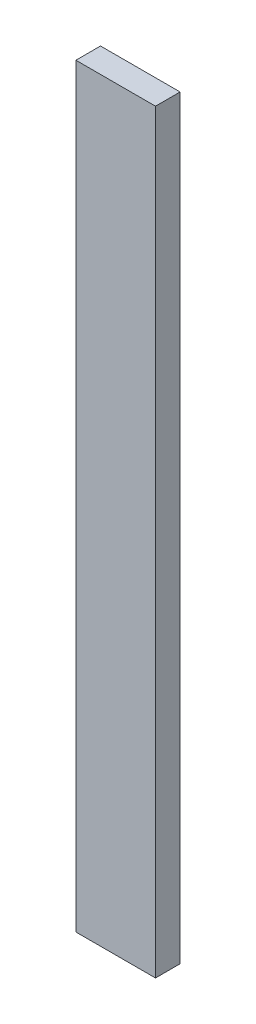
ISO-10303-21;
HEADER;
FILE_DESCRIPTION(('STEP AP214'),'2;1');
FILE_NAME('part.step','',(''),(''),'','','');
FILE_SCHEMA(('AUTOMOTIVE_DESIGN { 1 0 10303 214 1 1 1 1 }'));
ENDSEC;
DATA;
#1=APPLICATION_CONTEXT('core data for automotive mechanical design processes');
#2=APPLICATION_PROTOCOL_DEFINITION('international standard','automotive_design',2000,#1);
#3=PRODUCT_CONTEXT('',#1,'mechanical');
#4=PRODUCT('Part','Part','',(#3));
#5=PRODUCT_RELATED_PRODUCT_CATEGORY('part','',(#4));
#6=PRODUCT_DEFINITION_FORMATION('','',#4);
#7=PRODUCT_DEFINITION_CONTEXT('part definition',#1,'design');
#8=PRODUCT_DEFINITION('design','',#6,#7);
#9=PRODUCT_DEFINITION_SHAPE('','',#8);
#10=(LENGTH_UNIT() NAMED_UNIT(*) SI_UNIT(.MILLI.,.METRE.));
#11=(NAMED_UNIT(*) PLANE_ANGLE_UNIT() SI_UNIT($,.RADIAN.));
#12=(NAMED_UNIT(*) SI_UNIT($,.STERADIAN.) SOLID_ANGLE_UNIT());
#13=UNCERTAINTY_MEASURE_WITH_UNIT(LENGTH_MEASURE(1.E-05),#10,'distance_accuracy_value','');
#14=(GEOMETRIC_REPRESENTATION_CONTEXT(3) GLOBAL_UNCERTAINTY_ASSIGNED_CONTEXT((#13)) GLOBAL_UNIT_ASSIGNED_CONTEXT((#10,
#11,#12)) REPRESENTATION_CONTEXT('',''));
#15=CARTESIAN_POINT('',(0.,0.,0.));
#16=DIRECTION('',(0.,0.,1.));
#17=DIRECTION('',(1.,0.,0.));
#18=AXIS2_PLACEMENT_3D('',#15,#16,#17);
#19=CARTESIAN_POINT('',(-2.91645064696626,-1.83320044296789,6.5));
#20=DIRECTION('',(0.,0.,1.));
#21=DIRECTION('',(1.,0.,0.));
#22=AXIS2_PLACEMENT_3D('',#19,#20,#21);
#23=PLANE('',#22);
#24=DIRECTION('',(0.,1.,0.));
#25=VECTOR('',#24,1.);
#26=CARTESIAN_POINT('',(-1.94645064696626,7.36679955703211,6.5));
#27=LINE('',#26,#25);
#28=CARTESIAN_POINT('',(-1.94645064696626,7.36679955703211,6.5));
#29=VERTEX_POINT('',#28);
#30=CARTESIAN_POINT('',(-1.94645064696626,-1.83320044296789,6.5));
#31=VERTEX_POINT('',#30);
#32=EDGE_CURVE('E58',#29,#31,#27,.F.);
#33=ORIENTED_EDGE('',*,*,#32,.F.);
#34=DIRECTION('',(1.,0.,0.));
#35=VECTOR('',#34,1.);
#36=CARTESIAN_POINT('',(-2.91645064696626,7.36679955703211,6.5));
#37=LINE('',#36,#35);
#38=CARTESIAN_POINT('',(-2.91645064696626,7.36679955703211,6.5));
#39=VERTEX_POINT('',#38);
#40=EDGE_CURVE('E53',#39,#29,#37,.T.);
#41=ORIENTED_EDGE('',*,*,#40,.F.);
#42=DIRECTION('',(0.,-1.,0.));
#43=VECTOR('',#42,1.);
#44=CARTESIAN_POINT('',(-2.91645064696626,7.36679955703211,6.5));
#45=LINE('',#44,#43);
#46=CARTESIAN_POINT('',(-2.91645064696626,-1.83320044296789,6.5));
#47=VERTEX_POINT('',#46);
#48=EDGE_CURVE('E68',#47,#39,#45,.F.);
#49=ORIENTED_EDGE('',*,*,#48,.F.);
#50=DIRECTION('',(1.,0.,0.));
#51=VECTOR('',#50,1.);
#52=CARTESIAN_POINT('',(-2.91645064696626,-1.83320044296789,6.5));
#53=LINE('',#52,#51);
#54=EDGE_CURVE('E20',#31,#47,#53,.F.);
#55=ORIENTED_EDGE('',*,*,#54,.F.);
#56=EDGE_LOOP('',(#33,#41,#49,#55));
#57=FACE_BOUND('',#56,.T.);
#58=ADVANCED_FACE('F17',(#57),#23,.T.);
#59=CARTESIAN_POINT('',(-2.91645064696626,-1.83320044296789,6.2));
#60=DIRECTION('',(0.,-1.,0.));
#61=DIRECTION('',(1.,0.,0.));
#62=AXIS2_PLACEMENT_3D('',#59,#60,#61);
#63=PLANE('',#62);
#64=DIRECTION('',(1.,0.,0.));
#65=VECTOR('',#64,1.);
#66=CARTESIAN_POINT('',(-2.91645064696626,-1.83320044296789,6.2));
#67=LINE('',#66,#65);
#68=CARTESIAN_POINT('',(-2.91645064696626,-1.83320044296789,6.2));
#69=VERTEX_POINT('',#68);
#70=CARTESIAN_POINT('',(-1.94645064696626,-1.83320044296789,6.2));
#71=VERTEX_POINT('',#70);
#72=EDGE_CURVE('E74',#69,#71,#67,.T.);
#73=ORIENTED_EDGE('',*,*,#72,.T.);
#74=DIRECTION('',(0.,0.,-1.));
#75=VECTOR('',#74,1.);
#76=CARTESIAN_POINT('',(-1.94645064696626,-1.83320044296789,6.2));
#77=LINE('',#76,#75);
#78=EDGE_CURVE('E63',#31,#71,#77,.T.);
#79=ORIENTED_EDGE('',*,*,#78,.F.);
#80=ORIENTED_EDGE('',*,*,#54,.T.);
#81=DIRECTION('',(0.,0.,1.));
#82=VECTOR('',#81,1.);
#83=CARTESIAN_POINT('',(-2.91645064696626,-1.83320044296789,6.2));
#84=LINE('',#83,#82);
#85=EDGE_CURVE('E81',#69,#47,#84,.T.);
#86=ORIENTED_EDGE('',*,*,#85,.F.);
#87=EDGE_LOOP('',(#73,#79,#80,#86));
#88=FACE_BOUND('',#87,.T.);
#89=ADVANCED_FACE('F73',(#88),#63,.T.);
#90=CARTESIAN_POINT('',(-1.94645064696626,7.36679955703211,6.2));
#91=DIRECTION('',(1.,0.,0.));
#92=DIRECTION('',(0.,0.,-1.));
#93=AXIS2_PLACEMENT_3D('',#90,#91,#92);
#94=PLANE('',#93);
#95=DIRECTION('',(0.,1.,0.));
#96=VECTOR('',#95,1.);
#97=CARTESIAN_POINT('',(-1.94645064696626,-1.83320044296789,6.2));
#98=LINE('',#97,#96);
#99=CARTESIAN_POINT('',(-1.94645064696626,7.36679955703211,6.2));
#100=VERTEX_POINT('',#99);
#101=EDGE_CURVE('E84',#71,#100,#98,.T.);
#102=ORIENTED_EDGE('',*,*,#101,.T.);
#103=DIRECTION('',(0.,0.,1.));
#104=VECTOR('',#103,1.);
#105=CARTESIAN_POINT('',(-1.94645064696626,7.36679955703211,6.2));
#106=LINE('',#105,#104);
#107=EDGE_CURVE('E65',#29,#100,#106,.F.);
#108=ORIENTED_EDGE('',*,*,#107,.F.);
#109=ORIENTED_EDGE('',*,*,#32,.T.);
#110=ORIENTED_EDGE('',*,*,#78,.T.);
#111=EDGE_LOOP('',(#102,#108,#109,#110));
#112=FACE_BOUND('',#111,.T.);
#113=ADVANCED_FACE('F61',(#112),#94,.T.);
#114=CARTESIAN_POINT('',(-2.91645064696626,7.36679955703211,6.2));
#115=DIRECTION('',(0.,1.,0.));
#116=DIRECTION('',(0.,0.,1.));
#117=AXIS2_PLACEMENT_3D('',#114,#115,#116);
#118=PLANE('',#117);
#119=DIRECTION('',(1.,0.,0.));
#120=VECTOR('',#119,1.);
#121=CARTESIAN_POINT('',(-2.91645064696626,7.36679955703211,6.2));
#122=LINE('',#121,#120);
#123=CARTESIAN_POINT('',(-2.91645064696626,7.36679955703211,6.2));
#124=VERTEX_POINT('',#123);
#125=EDGE_CURVE('E26',#100,#124,#122,.F.);
#126=ORIENTED_EDGE('',*,*,#125,.T.);
#127=DIRECTION('',(0.,0.,1.));
#128=VECTOR('',#127,1.);
#129=CARTESIAN_POINT('',(-2.91645064696626,7.36679955703211,6.2));
#130=LINE('',#129,#128);
#131=EDGE_CURVE('E34',#39,#124,#130,.F.);
#132=ORIENTED_EDGE('',*,*,#131,.F.);
#133=ORIENTED_EDGE('',*,*,#40,.T.);
#134=ORIENTED_EDGE('',*,*,#107,.T.);
#135=EDGE_LOOP('',(#126,#132,#133,#134));
#136=FACE_BOUND('',#135,.T.);
#137=ADVANCED_FACE('F88',(#136),#118,.T.);
#138=CARTESIAN_POINT('',(-2.91645064696626,7.36679955703211,6.2));
#139=DIRECTION('',(-1.,0.,0.));
#140=DIRECTION('',(0.,-1.,0.));
#141=AXIS2_PLACEMENT_3D('',#138,#139,#140);
#142=PLANE('',#141);
#143=DIRECTION('',(0.,1.,0.));
#144=VECTOR('',#143,1.);
#145=CARTESIAN_POINT('',(-2.91645064696626,-1.83320044296789,6.2));
#146=LINE('',#145,#144);
#147=EDGE_CURVE('E11',#124,#69,#146,.F.);
#148=ORIENTED_EDGE('',*,*,#147,.T.);
#149=ORIENTED_EDGE('',*,*,#85,.T.);
#150=ORIENTED_EDGE('',*,*,#48,.T.);
#151=ORIENTED_EDGE('',*,*,#131,.T.);
#152=EDGE_LOOP('',(#148,#149,#150,#151));
#153=FACE_BOUND('',#152,.T.);
#154=ADVANCED_FACE('F91',(#153),#142,.T.);
#155=CARTESIAN_POINT('',(-2.91645064696626,-1.83320044296789,6.2));
#156=DIRECTION('',(0.,0.,1.));
#157=DIRECTION('',(1.,0.,0.));
#158=AXIS2_PLACEMENT_3D('',#155,#156,#157);
#159=PLANE('',#158);
#160=ORIENTED_EDGE('',*,*,#125,.F.);
#161=ORIENTED_EDGE('',*,*,#101,.F.);
#162=ORIENTED_EDGE('',*,*,#72,.F.);
#163=ORIENTED_EDGE('',*,*,#147,.F.);
#164=EDGE_LOOP('',(#160,#161,#162,#163));
#165=FACE_BOUND('',#164,.T.);
#166=ADVANCED_FACE('F90',(#165),#159,.F.);
#167=CLOSED_SHELL('',(#58,#89,#113,#137,#154,#166));
#168=MANIFOLD_SOLID_BREP('B1',#167);
#169=ADVANCED_BREP_SHAPE_REPRESENTATION('',(#18,#168),#14);
#170=SHAPE_DEFINITION_REPRESENTATION(#9,#169);
ENDSEC;
END-ISO-10303-21;
